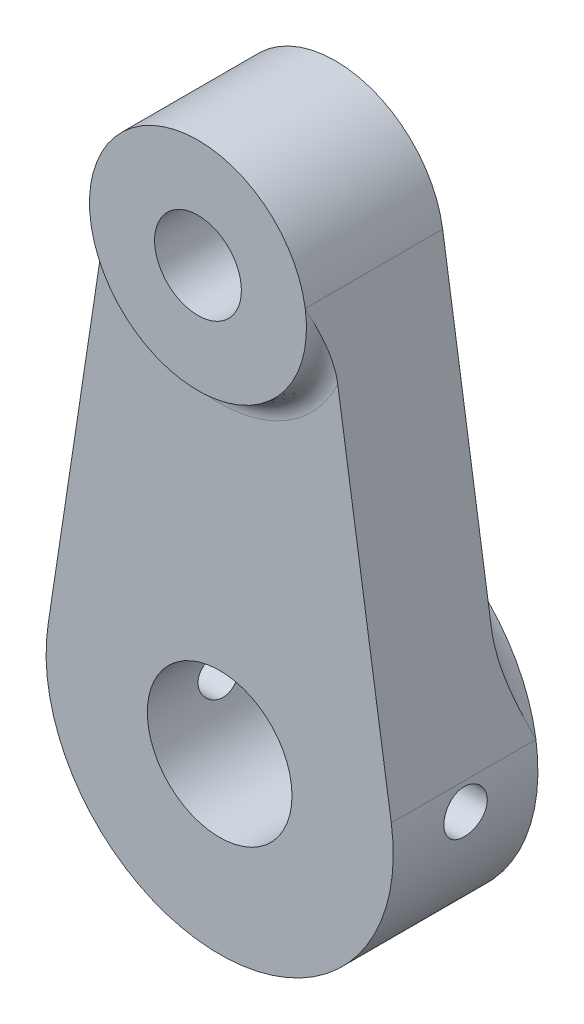
ISO-10303-21;
HEADER;
FILE_DESCRIPTION(('STEP AP214'),'2;1');
FILE_NAME('part.step','',(''),(''),'','','');
FILE_SCHEMA(('AUTOMOTIVE_DESIGN { 1 0 10303 214 1 1 1 1 }'));
ENDSEC;
DATA;
#1=APPLICATION_CONTEXT('core data for automotive mechanical design processes');
#2=APPLICATION_PROTOCOL_DEFINITION('international standard','automotive_design',2000,#1);
#3=PRODUCT_CONTEXT('',#1,'mechanical');
#4=PRODUCT('Part','Part','',(#3));
#5=PRODUCT_RELATED_PRODUCT_CATEGORY('part','',(#4));
#6=PRODUCT_DEFINITION_FORMATION('','',#4);
#7=PRODUCT_DEFINITION_CONTEXT('part definition',#1,'design');
#8=PRODUCT_DEFINITION('design','',#6,#7);
#9=PRODUCT_DEFINITION_SHAPE('','',#8);
#10=(LENGTH_UNIT() NAMED_UNIT(*) SI_UNIT(.MILLI.,.METRE.));
#11=(NAMED_UNIT(*) PLANE_ANGLE_UNIT() SI_UNIT($,.RADIAN.));
#12=(NAMED_UNIT(*) SI_UNIT($,.STERADIAN.) SOLID_ANGLE_UNIT());
#13=UNCERTAINTY_MEASURE_WITH_UNIT(LENGTH_MEASURE(1.E-05),#10,'distance_accuracy_value','');
#14=(GEOMETRIC_REPRESENTATION_CONTEXT(3) GLOBAL_UNCERTAINTY_ASSIGNED_CONTEXT((#13)) GLOBAL_UNIT_ASSIGNED_CONTEXT((#10,
#11,#12)) REPRESENTATION_CONTEXT('',''));
#15=CARTESIAN_POINT('',(0.,0.,0.));
#16=DIRECTION('',(0.,0.,1.));
#17=DIRECTION('',(1.,0.,0.));
#18=AXIS2_PLACEMENT_3D('',#15,#16,#17);
#19=CARTESIAN_POINT('',(0.,0.,9.5));
#20=DIRECTION('',(0.,0.,-1.));
#21=DIRECTION('',(-1.,0.,0.));
#22=AXIS2_PLACEMENT_3D('',#19,#20,#21);
#23=CYLINDRICAL_SURFACE('',#22,7.5);
#24=DIRECTION('',(0.,0.,-1.));
#25=VECTOR('',#24,1.);
#26=CARTESIAN_POINT('',(-7.41514497498195,1.125,8.));
#27=LINE('',#26,#25);
#28=CARTESIAN_POINT('',(-7.41514497498195,1.125,9.5));
#29=VERTEX_POINT('',#28);
#30=CARTESIAN_POINT('',(-7.41514497498195,1.125,0.));
#31=VERTEX_POINT('',#30);
#32=EDGE_CURVE('E131',#29,#31,#27,.T.);
#33=ORIENTED_EDGE('',*,*,#32,.F.);
#34=CARTESIAN_POINT('',(0.,0.,9.5));
#35=DIRECTION('',(0.,0.,1.));
#36=DIRECTION('',(1.,0.,0.));
#37=AXIS2_PLACEMENT_3D('',#34,#35,#36);
#38=CIRCLE('',#37,7.5);
#39=CARTESIAN_POINT('',(7.41514497498195,1.125,9.5));
#40=VERTEX_POINT('',#39);
#41=EDGE_CURVE('E146',#40,#29,#38,.T.);
#42=ORIENTED_EDGE('',*,*,#41,.F.);
#43=DIRECTION('',(0.,0.,-1.));
#44=VECTOR('',#43,1.);
#45=CARTESIAN_POINT('',(7.41514497498195,1.125,8.));
#46=LINE('',#45,#44);
#47=CARTESIAN_POINT('',(7.41514497498195,1.125,0.));
#48=VERTEX_POINT('',#47);
#49=EDGE_CURVE('E136',#40,#48,#46,.T.);
#50=ORIENTED_EDGE('',*,*,#49,.T.);
#51=CARTESIAN_POINT('',(0.,0.,0.));
#52=DIRECTION('',(0.,0.,1.));
#53=DIRECTION('',(1.,0.,0.));
#54=AXIS2_PLACEMENT_3D('',#51,#52,#53);
#55=CIRCLE('',#54,7.5);
#56=EDGE_CURVE('E143',#48,#31,#55,.T.);
#57=ORIENTED_EDGE('',*,*,#56,.T.);
#58=EDGE_LOOP('',(#33,#42,#50,#57));
#59=FACE_BOUND('',#58,.T.);
#60=ADVANCED_FACE('F45',(#59),#23,.T.);
#61=CARTESIAN_POINT('',(0.,0.,9.5));
#62=DIRECTION('',(0.,0.,1.));
#63=DIRECTION('',(1.,0.,0.));
#64=AXIS2_PLACEMENT_3D('',#61,#62,#63);
#65=PLANE('',#64);
#66=ORIENTED_EDGE('',*,*,#41,.T.);
#67=EDGE_CURVE('E149',#29,#40,#38,.T.);
#68=ORIENTED_EDGE('',*,*,#67,.T.);
#69=EDGE_LOOP('',(#66,#68));
#70=FACE_BOUND('',#69,.T.);
#71=CARTESIAN_POINT('',(0.,0.,9.5));
#72=DIRECTION('',(0.,0.,1.));
#73=DIRECTION('',(1.,0.,0.));
#74=AXIS2_PLACEMENT_3D('',#71,#72,#73);
#75=CIRCLE('',#74,3.);
#76=CARTESIAN_POINT('',(3.,0.,9.5));
#77=VERTEX_POINT('',#76);
#78=EDGE_CURVE('E140',#77,#77,#75,.T.);
#79=ORIENTED_EDGE('',*,*,#78,.F.);
#80=EDGE_LOOP('',(#79));
#81=FACE_BOUND('',#80,.T.);
#82=ADVANCED_FACE('F206',(#70,#81),#65,.T.);
#83=CARTESIAN_POINT('',(0.,0.,0.));
#84=DIRECTION('',(0.,0.,1.));
#85=DIRECTION('',(1.,0.,0.));
#86=AXIS2_PLACEMENT_3D('',#83,#84,#85);
#87=PLANE('',#86);
#88=DIRECTION('',(-0.15,0.98868599666426,0.));
#89=VECTOR('',#88,1.);
#90=CARTESIAN_POINT('',(7.41514497498195,1.125,0.));
#91=LINE('',#90,#89);
#92=CARTESIAN_POINT('',(10.7825665773319,-21.0704838873876,0.));
#93=VERTEX_POINT('',#92);
#94=EDGE_CURVE('E117',#93,#48,#91,.T.);
#95=ORIENTED_EDGE('',*,*,#94,.F.);
#96=CARTESIAN_POINT('',(0.,-30.,0.));
#97=DIRECTION('',(0.,0.,1.));
#98=DIRECTION('',(1.,0.,0.));
#99=AXIS2_PLACEMENT_3D('',#96,#97,#98);
#100=CIRCLE('',#99,14.);
#101=CARTESIAN_POINT('',(-10.7825665773319,-21.0704838873876,0.));
#102=VERTEX_POINT('',#101);
#103=EDGE_CURVE('E66',#93,#102,#100,.T.);
#104=ORIENTED_EDGE('',*,*,#103,.T.);
#105=DIRECTION('',(-0.15,-0.98868599666426,0.));
#106=VECTOR('',#105,1.);
#107=CARTESIAN_POINT('',(-7.41514497498195,1.125,0.));
#108=LINE('',#107,#106);
#109=EDGE_CURVE('E262',#31,#102,#108,.T.);
#110=ORIENTED_EDGE('',*,*,#109,.F.);
#111=ORIENTED_EDGE('',*,*,#56,.F.);
#112=EDGE_LOOP('',(#95,#104,#110,#111));
#113=FACE_BOUND('',#112,.T.);
#114=CARTESIAN_POINT('',(0.,0.,0.));
#115=DIRECTION('',(0.,0.,1.));
#116=DIRECTION('',(1.,0.,0.));
#117=AXIS2_PLACEMENT_3D('',#114,#115,#116);
#118=CIRCLE('',#117,3.);
#119=CARTESIAN_POINT('',(3.,0.,0.));
#120=VERTEX_POINT('',#119);
#121=EDGE_CURVE('E134',#120,#120,#118,.T.);
#122=ORIENTED_EDGE('',*,*,#121,.T.);
#123=EDGE_LOOP('',(#122));
#124=FACE_BOUND('',#123,.T.);
#125=ADVANCED_FACE('F213',(#113,#124),#87,.F.);
#126=CARTESIAN_POINT('',(0.,0.,9.5));
#127=DIRECTION('',(0.,0.,-1.));
#128=DIRECTION('',(-1.,0.,0.));
#129=AXIS2_PLACEMENT_3D('',#126,#127,#128);
#130=CYLINDRICAL_SURFACE('',#129,3.);
#131=ORIENTED_EDGE('',*,*,#78,.T.);
#132=EDGE_LOOP('',(#131));
#133=FACE_BOUND('',#132,.T.);
#134=ORIENTED_EDGE('',*,*,#121,.F.);
#135=EDGE_LOOP('',(#134));
#136=FACE_BOUND('',#135,.T.);
#137=ADVANCED_FACE('F244',(#133,#136),#130,.F.);
#138=CARTESIAN_POINT('',(-7.41514497498195,1.125,8.));
#139=DIRECTION('',(0.988685996664259,-0.15,0.));
#140=DIRECTION('',(0.15,0.98868599666426,0.));
#141=AXIS2_PLACEMENT_3D('',#138,#139,#140);
#142=PLANE('',#141);
#143=ORIENTED_EDGE('',*,*,#109,.T.);
#144=CARTESIAN_POINT('',(-10.7825665773319,-21.0704838873876,0.));
#145=CARTESIAN_POINT('',(-10.8036188188682,-21.2092442634229,-2.31503582348631E-05));
#146=CARTESIAN_POINT('',(-10.8246640712579,-21.3479585723159,-0.00391806260204699));
#147=CARTESIAN_POINT('',(-10.8666887706968,-21.6249534513113,-0.0186159968667627));
#148=CARTESIAN_POINT('',(-10.887668249274,-21.7632342292218,-0.0294149369178183));
#149=CARTESIAN_POINT('',(-10.9294771832798,-22.0388069464687,-0.0570495952061969));
#150=CARTESIAN_POINT('',(-10.9503068922632,-22.1761005570447,-0.0738686921604529));
#151=CARTESIAN_POINT('',(-10.9918550643829,-22.4499545301235,-0.112867745946441));
#152=CARTESIAN_POINT('',(-11.01257350871,-22.5865147686489,-0.135048581727671));
#153=CARTESIAN_POINT('',(-11.0741349985146,-22.9922813213399,-0.208221031006377));
#154=CARTESIAN_POINT('',(-11.1147941568967,-23.2602755915302,-0.266139002220647));
#155=CARTESIAN_POINT('',(-11.1956006419788,-23.7928905264656,-0.396600430720081));
#156=CARTESIAN_POINT('',(-11.2357475313623,-24.057508308753,-0.469155597397371));
#157=CARTESIAN_POINT('',(-11.3255176943163,-24.6492049956257,-0.645181872773761));
#158=CARTESIAN_POINT('',(-11.3749988644639,-24.975347262449,-0.751846245702443));
#159=CARTESIAN_POINT('',(-11.4733210373914,-25.623412299349,-0.977637512728872));
#160=CARTESIAN_POINT('',(-11.5221618536528,-25.9453338400379,-1.09676795093991));
#161=CARTESIAN_POINT('',(-11.668199360084,-26.9079020906793,-1.46654223551398));
#162=CARTESIAN_POINT('',(-11.764705168652,-27.5439950341984,-1.7291231398053));
#163=CARTESIAN_POINT('',(-11.8622035910899,-28.1866305339407,-1.99447949140113));
#164=CARTESIAN_POINT('',(-11.8632177762007,-28.1933152713876,-1.99723975408257));
#165=CARTESIAN_POINT('',(-11.8642319599711,-28.2,-2.));
#166=B_SPLINE_CURVE_WITH_KNOTS('',3,(#144,#145,#146,#147,#148,#149,#150,#151,#152,#153,#154,
#155,#156,#157,#158,#159,#160,#161,#162,#163,#164,#165),.UNSPECIFIED.,.F.,.F.,(4,2,2,2,2,2,2,2,
2,2,4),(0.,0.420924555769308,0.841600471990226,1.26112377507249,1.68071589727683,
2.51167215622664,3.3432958144477,4.38298370857807,5.42296799411915,7.50726078508849,
7.5291696874557),.UNSPECIFIED.);
#167=CARTESIAN_POINT('',(-11.8642319599711,-28.2,-2.));
#168=VERTEX_POINT('',#167);
#169=EDGE_CURVE('E11',#102,#168,#166,.T.);
#170=ORIENTED_EDGE('',*,*,#169,.T.);
#171=DIRECTION('',(0.,0.,-1.));
#172=VECTOR('',#171,1.);
#173=CARTESIAN_POINT('',(-11.8642319599711,-28.2,8.));
#174=LINE('',#173,#172);
#175=CARTESIAN_POINT('',(-11.8642319599711,-28.2,8.));
#176=VERTEX_POINT('',#175);
#177=EDGE_CURVE('E122',#176,#168,#174,.T.);
#178=ORIENTED_EDGE('',*,*,#177,.F.);
#179=DIRECTION('',(-0.15,-0.98868599666426,0.));
#180=VECTOR('',#179,1.);
#181=CARTESIAN_POINT('',(-7.41514497498195,1.125,8.));
#182=LINE('',#181,#180);
#183=CARTESIAN_POINT('',(-8.16138555281191,-3.79365072962088,8.));
#184=VERTEX_POINT('',#183);
#185=EDGE_CURVE('E104',#184,#176,#182,.T.);
#186=ORIENTED_EDGE('',*,*,#185,.F.);
#187=CARTESIAN_POINT('',(-8.16138555281191,-3.79365072962087,8.));
#188=CARTESIAN_POINT('',(-8.14750829911001,-3.70218242023938,8.0000121403172));
#189=CARTESIAN_POINT('',(-8.13363546717819,-3.61074325580559,8.00261451640834));
#190=CARTESIAN_POINT('',(-8.10593463809668,-3.42816044374639,8.01248057239108));
#191=CARTESIAN_POINT('',(-8.09210661948581,-3.33701665466516,8.01974152771349));
#192=CARTESIAN_POINT('',(-8.06455435732332,-3.15541308282199,8.03838025669386));
#193=CARTESIAN_POINT('',(-8.05082993048742,-3.06495209198932,8.04974626443729));
#194=CARTESIAN_POINT('',(-8.02345993863703,-2.88454990751402,8.07616459264724));
#195=CARTESIAN_POINT('',(-8.00981438673593,-2.79460880030489,8.09121750900753));
#196=CARTESIAN_POINT('',(-7.96931871353119,-2.52769210015145,8.1409327870465));
#197=CARTESIAN_POINT('',(-7.94259957938341,-2.35157987498539,8.18038019406932));
#198=CARTESIAN_POINT('',(-7.88953678468591,-2.00183026124352,8.26954900399619));
#199=CARTESIAN_POINT('',(-7.86319345680928,-1.82819506539574,8.31927897089961));
#200=CARTESIAN_POINT('',(-7.80108061911117,-1.41879444642777,8.44699925650627));
#201=CARTESIAN_POINT('',(-7.76547914832748,-1.18413660893117,8.52859539345209));
#202=CARTESIAN_POINT('',(-7.69488155857262,-0.718810953005341,8.70244113026362));
#203=CARTESIAN_POINT('',(-7.65988540847132,-0.488142929389905,8.79469018039228));
#204=CARTESIAN_POINT('',(-7.55532931919628,0.2010113461583,9.08212824512962));
#205=CARTESIAN_POINT('',(-7.48641184808941,0.655262936884536,9.28752409132617));
#206=CARTESIAN_POINT('',(-7.41672611215885,1.11457834542926,9.49528597324246));
#207=CARTESIAN_POINT('',(-7.41593554273077,1.11978917824882,9.49764299628243));
#208=CARTESIAN_POINT('',(-7.41514497498195,1.125,9.5));
#209=B_SPLINE_CURVE_WITH_KNOTS('',3,(#187,#188,#189,#190,#191,#192,#193,#194,#195,#196,#197,
#198,#199,#200,#201,#202,#203,#204,#205,#206,#207,#208),.UNSPECIFIED.,.F.,.F.,(4,2,2,2,2,2,2,2,
2,2,4),(0.,0.277466363585567,0.554770598761664,0.83128625044048,1.10784662327408,
1.65474565598516,2.20210203067785,2.95462836173667,3.70711587647497,5.21652765572335,
5.23384816385479),.UNSPECIFIED.);
#210=EDGE_CURVE('E222',#184,#29,#209,.T.);
#211=ORIENTED_EDGE('',*,*,#210,.T.);
#212=ORIENTED_EDGE('',*,*,#32,.T.);
#213=EDGE_LOOP('',(#143,#170,#178,#186,#211,#212));
#214=FACE_BOUND('',#213,.T.);
#215=ADVANCED_FACE('F128',(#214),#142,.F.);
#216=CARTESIAN_POINT('',(7.41514497498195,1.125,8.));
#217=DIRECTION('',(-0.988685996664259,-0.15,0.));
#218=DIRECTION('',(0.15,-0.98868599666426,0.));
#219=AXIS2_PLACEMENT_3D('',#216,#217,#218);
#220=PLANE('',#219);
#221=DIRECTION('',(0.,0.,-1.));
#222=VECTOR('',#221,1.);
#223=CARTESIAN_POINT('',(11.8642319599711,-28.2,8.));
#224=LINE('',#223,#222);
#225=CARTESIAN_POINT('',(11.8642319599711,-28.2,8.));
#226=VERTEX_POINT('',#225);
#227=CARTESIAN_POINT('',(11.8642319599711,-28.2,-2.));
#228=VERTEX_POINT('',#227);
#229=EDGE_CURVE('E123',#226,#228,#224,.T.);
#230=ORIENTED_EDGE('',*,*,#229,.T.);
#231=CARTESIAN_POINT('',(10.7825665773319,-21.0704838873876,0.));
#232=CARTESIAN_POINT('',(10.8036188188682,-21.2092442634229,-2.31503582348631E-05));
#233=CARTESIAN_POINT('',(10.8246640712579,-21.3479585723159,-0.00391806260204699));
#234=CARTESIAN_POINT('',(10.8666887706968,-21.6249534513113,-0.0186159968667627));
#235=CARTESIAN_POINT('',(10.887668249274,-21.7632342292218,-0.0294149369178183));
#236=CARTESIAN_POINT('',(10.9294771832798,-22.0388069464687,-0.0570495952061969));
#237=CARTESIAN_POINT('',(10.9503068922632,-22.1761005570447,-0.0738686921604529));
#238=CARTESIAN_POINT('',(10.9918550643829,-22.4499545301235,-0.112867745946441));
#239=CARTESIAN_POINT('',(11.01257350871,-22.5865147686489,-0.135048581727671));
#240=CARTESIAN_POINT('',(11.0741349985146,-22.9922813213399,-0.208221031006377));
#241=CARTESIAN_POINT('',(11.1147941568967,-23.2602755915302,-0.266139002220647));
#242=CARTESIAN_POINT('',(11.1956006419788,-23.7928905264656,-0.396600430720081));
#243=CARTESIAN_POINT('',(11.2357475313623,-24.057508308753,-0.469155597397371));
#244=CARTESIAN_POINT('',(11.3255176943163,-24.6492049956257,-0.645181872773761));
#245=CARTESIAN_POINT('',(11.3749988644639,-24.975347262449,-0.751846245702443));
#246=CARTESIAN_POINT('',(11.4733210373914,-25.623412299349,-0.977637512728872));
#247=CARTESIAN_POINT('',(11.5221618536528,-25.9453338400379,-1.09676795093991));
#248=CARTESIAN_POINT('',(11.668199360084,-26.9079020906793,-1.46654223551398));
#249=CARTESIAN_POINT('',(11.764705168652,-27.5439950341984,-1.7291231398053));
#250=CARTESIAN_POINT('',(11.8622035910899,-28.1866305339407,-1.99447949140113));
#251=CARTESIAN_POINT('',(11.8632177762007,-28.1933152713876,-1.99723975408257));
#252=CARTESIAN_POINT('',(11.8642319599711,-28.2,-2.));
#253=B_SPLINE_CURVE_WITH_KNOTS('',3,(#231,#232,#233,#234,#235,#236,#237,#238,#239,#240,#241,
#242,#243,#244,#245,#246,#247,#248,#249,#250,#251,#252),.UNSPECIFIED.,.F.,.F.,(4,2,2,2,2,2,2,2,
2,2,4),(0.,0.420924555769308,0.841600471990226,1.26112377507249,1.68071589727683,
2.51167215622664,3.3432958144477,4.38298370857807,5.42296799411915,7.50726078508849,
7.5291696874557),.UNSPECIFIED.);
#254=EDGE_CURVE('E59',#228,#93,#253,.F.);
#255=ORIENTED_EDGE('',*,*,#254,.T.);
#256=ORIENTED_EDGE('',*,*,#94,.T.);
#257=ORIENTED_EDGE('',*,*,#49,.F.);
#258=CARTESIAN_POINT('',(8.16138555281191,-3.79365072962087,8.));
#259=CARTESIAN_POINT('',(8.14750829911001,-3.70218242023938,8.0000121403172));
#260=CARTESIAN_POINT('',(8.13363546717819,-3.61074325580559,8.00261451640834));
#261=CARTESIAN_POINT('',(8.10593463809668,-3.42816044374639,8.01248057239108));
#262=CARTESIAN_POINT('',(8.09210661948581,-3.33701665466516,8.01974152771349));
#263=CARTESIAN_POINT('',(8.06455435732332,-3.15541308282199,8.03838025669386));
#264=CARTESIAN_POINT('',(8.05082993048742,-3.06495209198932,8.04974626443729));
#265=CARTESIAN_POINT('',(8.02345993863703,-2.88454990751402,8.07616459264724));
#266=CARTESIAN_POINT('',(8.00981438673593,-2.79460880030489,8.09121750900753));
#267=CARTESIAN_POINT('',(7.96931871353119,-2.52769210015145,8.1409327870465));
#268=CARTESIAN_POINT('',(7.94259957938341,-2.35157987498539,8.18038019406932));
#269=CARTESIAN_POINT('',(7.88953678468591,-2.00183026124352,8.26954900399619));
#270=CARTESIAN_POINT('',(7.86319345680928,-1.82819506539574,8.31927897089961));
#271=CARTESIAN_POINT('',(7.80108061911117,-1.41879444642777,8.44699925650627));
#272=CARTESIAN_POINT('',(7.76547914832748,-1.18413660893117,8.52859539345209));
#273=CARTESIAN_POINT('',(7.69488155857262,-0.718810953005341,8.70244113026362));
#274=CARTESIAN_POINT('',(7.65988540847132,-0.488142929389905,8.79469018039228));
#275=CARTESIAN_POINT('',(7.55532931919628,0.2010113461583,9.08212824512962));
#276=CARTESIAN_POINT('',(7.48641184808941,0.655262936884536,9.28752409132617));
#277=CARTESIAN_POINT('',(7.41672611215885,1.11457834542926,9.49528597324246));
#278=CARTESIAN_POINT('',(7.41593554273077,1.11978917824882,9.49764299628243));
#279=CARTESIAN_POINT('',(7.41514497498195,1.125,9.5));
#280=B_SPLINE_CURVE_WITH_KNOTS('',3,(#258,#259,#260,#261,#262,#263,#264,#265,#266,#267,#268,
#269,#270,#271,#272,#273,#274,#275,#276,#277,#278,#279),.UNSPECIFIED.,.F.,.F.,(4,2,2,2,2,2,2,2,
2,2,4),(0.,0.277466363585567,0.554770598761664,0.83128625044048,1.10784662327408,
1.65474565598516,2.20210203067785,2.95462836173667,3.70711587647497,5.21652765572335,
5.23384816385479),.UNSPECIFIED.);
#281=CARTESIAN_POINT('',(8.16138555281191,-3.79365072962088,8.));
#282=VERTEX_POINT('',#281);
#283=EDGE_CURVE('E228',#40,#282,#280,.F.);
#284=ORIENTED_EDGE('',*,*,#283,.T.);
#285=DIRECTION('',(-0.15,0.98868599666426,0.));
#286=VECTOR('',#285,1.);
#287=CARTESIAN_POINT('',(7.41514497498195,1.125,8.));
#288=LINE('',#287,#286);
#289=EDGE_CURVE('E116',#226,#282,#288,.T.);
#290=ORIENTED_EDGE('',*,*,#289,.F.);
#291=EDGE_LOOP('',(#230,#255,#256,#257,#284,#290));
#292=FACE_BOUND('',#291,.T.);
#293=ADVANCED_FACE('F202',(#292),#220,.F.);
#294=CARTESIAN_POINT('',(0.,0.,8.));
#295=DIRECTION('',(0.,0.,1.));
#296=DIRECTION('',(1.,0.,0.));
#297=AXIS2_PLACEMENT_3D('',#294,#295,#296);
#298=PLANE('',#297);
#299=ORIENTED_EDGE('',*,*,#289,.T.);
#300=CARTESIAN_POINT('',(0.,0.,8.));
#301=DIRECTION('',(0.,0.,1.));
#302=DIRECTION('',(1.,0.,0.));
#303=AXIS2_PLACEMENT_3D('',#300,#301,#302);
#304=CIRCLE('',#303,9.);
#305=EDGE_CURVE('E112',#282,#184,#304,.F.);
#306=ORIENTED_EDGE('',*,*,#305,.T.);
#307=ORIENTED_EDGE('',*,*,#185,.T.);
#308=CARTESIAN_POINT('',(0.,-30.,8.));
#309=DIRECTION('',(0.,0.,1.));
#310=DIRECTION('',(1.,0.,0.));
#311=AXIS2_PLACEMENT_3D('',#308,#309,#310);
#312=CIRCLE('',#311,12.);
#313=EDGE_CURVE('E109',#176,#226,#312,.T.);
#314=ORIENTED_EDGE('',*,*,#313,.T.);
#315=EDGE_LOOP('',(#299,#306,#307,#314));
#316=FACE_BOUND('',#315,.T.);
#317=CARTESIAN_POINT('',(0.,-30.,8.));
#318=DIRECTION('',(0.,0.,1.));
#319=DIRECTION('',(1.,0.,0.));
#320=AXIS2_PLACEMENT_3D('',#317,#318,#319);
#321=CIRCLE('',#320,5.);
#322=CARTESIAN_POINT('',(5.,-30.,8.));
#323=VERTEX_POINT('',#322);
#324=EDGE_CURVE('E126',#323,#323,#321,.T.);
#325=ORIENTED_EDGE('',*,*,#324,.F.);
#326=EDGE_LOOP('',(#325));
#327=FACE_BOUND('',#326,.T.);
#328=ADVANCED_FACE('F107',(#316,#327),#298,.T.);
#329=CARTESIAN_POINT('',(0.,-30.,-2.));
#330=DIRECTION('',(0.,0.,1.));
#331=DIRECTION('',(1.,0.,0.));
#332=AXIS2_PLACEMENT_3D('',#329,#330,#331);
#333=CYLINDRICAL_SURFACE('',#332,12.);
#334=CARTESIAN_POINT('',(-12.,-30.,1.5));
#335=CARTESIAN_POINT('',(-11.9999988293786,-30.0839046573335,1.50000356456143));
#336=CARTESIAN_POINT('',(-11.9991107073294,-30.1678617445816,1.50706372750157));
#337=CARTESIAN_POINT('',(-11.9956532406682,-30.3334396812539,1.53511665274248));
#338=CARTESIAN_POINT('',(-11.9930821406486,-30.4150579983742,1.55612396275403));
#339=CARTESIAN_POINT('',(-11.9865483662664,-30.5735373448878,1.61144258634845));
#340=CARTESIAN_POINT('',(-11.9825866287333,-30.6504015360877,1.64574494508591));
#341=CARTESIAN_POINT('',(-11.9737122052686,-30.7972676849358,1.72666037038187));
#342=CARTESIAN_POINT('',(-11.9687996825047,-30.8672708169338,1.77327132511843));
#343=CARTESIAN_POINT('',(-11.958541927838,-30.9988276901588,1.87775516990375));
#344=CARTESIAN_POINT('',(-11.9531946881545,-31.0603382189623,1.93568227760774));
#345=CARTESIAN_POINT('',(-11.9426863560585,-31.1727916761345,2.06103769412198));
#346=CARTESIAN_POINT('',(-11.9375252731456,-31.2237340658353,2.12846648694794));
#347=CARTESIAN_POINT('',(-11.9279538337175,-31.3137660967704,2.27119198653939));
#348=CARTESIAN_POINT('',(-11.9235460630675,-31.3528152575646,2.34651441694076));
#349=CARTESIAN_POINT('',(-11.9160067707461,-31.4176938459451,2.50271223116841));
#350=CARTESIAN_POINT('',(-11.9128752006788,-31.4435237748391,2.58358740428821));
#351=CARTESIAN_POINT('',(-11.9082620376217,-31.4810993880149,2.74814651735206));
#352=CARTESIAN_POINT('',(-11.9067719006205,-31.492918028839,2.83181355462252));
#353=CARTESIAN_POINT('',(-11.9055841688568,-31.5023613297343,2.9999557580831));
#354=CARTESIAN_POINT('',(-11.905886502009,-31.4999865606014,3.08443089163878));
#355=CARTESIAN_POINT('',(-11.9082417322185,-31.4811703418687,3.25128289634927));
#356=CARTESIAN_POINT('',(-11.910284627762,-31.4648092577908,3.33366899172016));
#357=CARTESIAN_POINT('',(-11.9158751985458,-31.4186102299092,3.49451701273139));
#358=CARTESIAN_POINT('',(-11.9194229042743,-31.3887720130511,3.57297885882842));
#359=CARTESIAN_POINT('',(-11.9276346951879,-31.316379335947,3.72400079941301));
#360=CARTESIAN_POINT('',(-11.9323018392687,-31.2737899522246,3.79654398014939));
#361=CARTESIAN_POINT('',(-11.9422242685836,-31.1771288816741,3.93348401664795));
#362=CARTESIAN_POINT('',(-11.947479580714,-31.1230566696485,3.99788049958421));
#363=CARTESIAN_POINT('',(-11.9580306593425,-31.0045194664523,4.11716562643365));
#364=CARTESIAN_POINT('',(-11.9633264543213,-30.939985204704,4.17198545505959));
#365=CARTESIAN_POINT('',(-11.9733277953351,-30.8025943014683,4.27002532801833));
#366=CARTESIAN_POINT('',(-11.978033340009,-30.7297376407909,4.3132453456032));
#367=CARTESIAN_POINT('',(-11.9863269133115,-30.5777170028181,4.38685879227835));
#368=CARTESIAN_POINT('',(-11.9899145664092,-30.4985509172026,4.41724791232874));
#369=CARTESIAN_POINT('',(-11.9955647146804,-30.3361847642586,4.46428229611395));
#370=CARTESIAN_POINT('',(-11.9976272812552,-30.2529848859784,4.48092820328223));
#371=CARTESIAN_POINT('',(-11.9999855784646,-30.0855078983481,4.49991445455633));
#372=CARTESIAN_POINT('',(-12.0002930168558,-30.0012416941192,4.50234959541844));
#373=CARTESIAN_POINT('',(-11.9991380280326,-29.8335023781015,4.49309535956643));
#374=CARTESIAN_POINT('',(-11.9976756385093,-29.7500292494612,4.48140628364905));
#375=CARTESIAN_POINT('',(-11.9931526125402,-29.5865252953671,4.44431417473537));
#376=CARTESIAN_POINT('',(-11.9900972448832,-29.5064840577452,4.41895634195842));
#377=CARTESIAN_POINT('',(-11.9827303386012,-29.351790207085,4.35529352885225));
#378=CARTESIAN_POINT('',(-11.9784187573237,-29.2771377771208,4.31698810890514));
#379=CARTESIAN_POINT('',(-11.9689909374607,-29.1349172875875,4.22828811749552));
#380=CARTESIAN_POINT('',(-11.9638706642551,-29.0673877440337,4.17783222611662));
#381=CARTESIAN_POINT('',(-11.9534108539539,-28.9417218062242,4.06635030147948));
#382=CARTESIAN_POINT('',(-11.9480713081614,-28.8835857849979,4.00532384864941));
#383=CARTESIAN_POINT('',(-11.9377386327755,-28.7780208247092,3.87401554994572));
#384=CARTESIAN_POINT('',(-11.932747648328,-28.7306547236592,3.80368299221377));
#385=CARTESIAN_POINT('',(-11.9237124662229,-28.6484082663339,3.65600505308717));
#386=CARTESIAN_POINT('',(-11.9196682495862,-28.613527659763,3.57865981231409));
#387=CARTESIAN_POINT('',(-11.912999102358,-28.5573440526801,3.41935480851143));
#388=CARTESIAN_POINT('',(-11.9103704711087,-28.5360056235257,3.33740770197122));
#389=CARTESIAN_POINT('',(-11.9068194954447,-28.5073980036793,3.1710585097316));
#390=CARTESIAN_POINT('',(-11.9058970716527,-28.5001281584785,3.0866565384246));
#391=CARTESIAN_POINT('',(-11.9058652618947,-28.4998760783491,2.91841864247719));
#392=CARTESIAN_POINT('',(-11.9067433485117,-28.5067951213804,2.83458285100087));
#393=CARTESIAN_POINT('',(-11.9101866872232,-28.5345153570904,2.66927572239295));
#394=CARTESIAN_POINT('',(-11.9127519394985,-28.5553165512565,2.58780438551472));
#395=CARTESIAN_POINT('',(-11.9192766946473,-28.6101797557862,2.42955182594016));
#396=CARTESIAN_POINT('',(-11.9232356975567,-28.6442370114174,2.35276893298691));
#397=CARTESIAN_POINT('',(-11.9321026994689,-28.7246358587098,2.20599200757101));
#398=CARTESIAN_POINT('',(-11.9370107103625,-28.7709776042942,2.1359980601881));
#399=CARTESIAN_POINT('',(-11.9472636285134,-28.8749962012405,2.00428126479572));
#400=CARTESIAN_POINT('',(-11.9526112325042,-28.932746624535,1.94261672342701));
#401=CARTESIAN_POINT('',(-11.9631169895574,-29.057789863819,1.82981590489922));
#402=CARTESIAN_POINT('',(-11.9682750976535,-29.1250849265151,1.77868211353541));
#403=CARTESIAN_POINT('',(-11.9778423395205,-29.2676006274875,1.68822878573682));
#404=CARTESIAN_POINT('',(-11.9822485504698,-29.3428504322423,1.64895491646045));
#405=CARTESIAN_POINT('',(-11.9897858944604,-29.4988902586192,1.58365725425023));
#406=CARTESIAN_POINT('',(-11.9929184122174,-29.5796741514779,1.55761906418792));
#407=CARTESIAN_POINT('',(-11.9968003219665,-29.7173965368192,1.52576439709722));
#408=CARTESIAN_POINT('',(-11.9979943553727,-29.7734666018898,1.51611663481076));
#409=CARTESIAN_POINT('',(-11.9995945879751,-29.8863497620725,1.50323325258406));
#410=CARTESIAN_POINT('',(-12.0000007929808,-29.9431628517024,1.49999758536042));
#411=CARTESIAN_POINT('',(-12.,-30.,1.5));
#412=B_SPLINE_CURVE_WITH_KNOTS('',3,(#334,#335,#336,#337,#338,#339,#340,#341,#342,#343,#344,
#345,#346,#347,#348,#349,#350,#351,#352,#353,#354,#355,#356,#357,#358,#359,#360,#361,#362,#363,
#364,#365,#366,#367,#368,#369,#370,#371,#372,#373,#374,#375,#376,#377,#378,#379,#380,#381,#382,
#383,#384,#385,#386,#387,#388,#389,#390,#391,#392,#393,#394,#395,#396,#397,#398,#399,#400,#401,
#402,#403,#404,#405,#406,#407,#408,#409,#410,#411),.UNSPECIFIED.,.T.,.F.,(4,2,2,2,2,2,2,2,2,2,2,
2,2,2,2,2,2,2,2,2,2,2,2,2,2,2,2,2,2,2,2,2,2,2,2,2,2,2,4),(0.,0.251506363665749,
0.503275476566057,0.754875304909062,1.00643199354644,1.25922487921106,1.51203064680006,
1.76568750191322,2.01933473698084,2.27165535171793,2.52396581930799,2.77483617865015,
3.02571162099745,3.2772805577132,3.52886100308183,3.7821808688185,4.03550131867869,
4.28890677438964,4.54230036542269,4.79400167635153,5.04569762701158,5.29656632336038,
5.54744353847369,5.79961441757054,6.05179530825054,6.30541182904545,6.55902326532924,
6.81196844568556,7.06490185806375,7.3160814072133,7.5672609832773,7.81835054823894,
8.06944325947359,8.32221142615099,8.57503919082009,8.82882841822113,9.08234099210421,
9.25271305912579,9.42308386980263),.UNSPECIFIED.);
#413=CARTESIAN_POINT('',(-12.,-30.,1.5));
#414=VERTEX_POINT('',#413);
#415=EDGE_CURVE('E186',#414,#414,#412,.T.);
#416=ORIENTED_EDGE('',*,*,#415,.F.);
#417=EDGE_LOOP('',(#416));
#418=FACE_BOUND('',#417,.T.);
#419=CARTESIAN_POINT('',(12.,-30.,1.5));
#420=CARTESIAN_POINT('',(11.9999988293786,-29.9160953426665,1.50000356456143));
#421=CARTESIAN_POINT('',(11.9991107073294,-29.8321382554184,1.50706372750157));
#422=CARTESIAN_POINT('',(11.9956532406682,-29.6665603187461,1.53511665274248));
#423=CARTESIAN_POINT('',(11.9930821406486,-29.5849420016258,1.55612396275403));
#424=CARTESIAN_POINT('',(11.9865483662664,-29.4264626551122,1.61144258634845));
#425=CARTESIAN_POINT('',(11.9825866287333,-29.3495984639123,1.64574494508591));
#426=CARTESIAN_POINT('',(11.9737122052686,-29.2027323150642,1.72666037038187));
#427=CARTESIAN_POINT('',(11.9687996825047,-29.1327291830662,1.77327132511843));
#428=CARTESIAN_POINT('',(11.958541927838,-29.0011723098412,1.87775516990375));
#429=CARTESIAN_POINT('',(11.9531946881545,-28.9396617810377,1.93568227760774));
#430=CARTESIAN_POINT('',(11.9426863560585,-28.8272083238655,2.06103769412198));
#431=CARTESIAN_POINT('',(11.9375252731456,-28.7762659341646,2.12846648694794));
#432=CARTESIAN_POINT('',(11.9279538337175,-28.6862339032296,2.27119198653939));
#433=CARTESIAN_POINT('',(11.9235460630675,-28.6471847424354,2.34651441694076));
#434=CARTESIAN_POINT('',(11.9160067707461,-28.5823061540549,2.50271223116841));
#435=CARTESIAN_POINT('',(11.9128752006788,-28.5564762251609,2.5835874042882));
#436=CARTESIAN_POINT('',(11.9082620376217,-28.5189006119851,2.74814651735206));
#437=CARTESIAN_POINT('',(11.9067719006205,-28.507081971161,2.83181355462251));
#438=CARTESIAN_POINT('',(11.9055841688568,-28.4976386702657,2.9999557580831));
#439=CARTESIAN_POINT('',(11.905886502009,-28.5000134393985,3.08443089163877));
#440=CARTESIAN_POINT('',(11.9082417322185,-28.5188296581312,3.25128289634927));
#441=CARTESIAN_POINT('',(11.910284627762,-28.5351907422092,3.33366899172016));
#442=CARTESIAN_POINT('',(11.9158751985458,-28.5813897700908,3.49451701273139));
#443=CARTESIAN_POINT('',(11.9194229042743,-28.6112279869489,3.57297885882842));
#444=CARTESIAN_POINT('',(11.9276346951879,-28.683620664053,3.72400079941301));
#445=CARTESIAN_POINT('',(11.9323018392687,-28.7262100477754,3.79654398014939));
#446=CARTESIAN_POINT('',(11.9422242685836,-28.8228711183258,3.93348401664795));
#447=CARTESIAN_POINT('',(11.947479580714,-28.8769433303515,3.99788049958421));
#448=CARTESIAN_POINT('',(11.9580306593425,-28.9954805335477,4.11716562643365));
#449=CARTESIAN_POINT('',(11.9633264543213,-29.060014795296,4.17198545505959));
#450=CARTESIAN_POINT('',(11.9733277953351,-29.1974056985316,4.27002532801833));
#451=CARTESIAN_POINT('',(11.978033340009,-29.270262359209,4.3132453456032));
#452=CARTESIAN_POINT('',(11.9863269133115,-29.4222829971819,4.38685879227835));
#453=CARTESIAN_POINT('',(11.9899145664092,-29.5014490827974,4.41724791232874));
#454=CARTESIAN_POINT('',(11.9955647146804,-29.6638152357414,4.46428229611395));
#455=CARTESIAN_POINT('',(11.9976272812552,-29.7470151140216,4.48092820328223));
#456=CARTESIAN_POINT('',(11.9999855784646,-29.9144921016519,4.49991445455633));
#457=CARTESIAN_POINT('',(12.0002930168558,-29.9987583058808,4.50234959541844));
#458=CARTESIAN_POINT('',(11.9991380280326,-30.1664976218985,4.49309535956643));
#459=CARTESIAN_POINT('',(11.9976756385093,-30.2499707505388,4.48140628364905));
#460=CARTESIAN_POINT('',(11.9931526125402,-30.4134747046329,4.44431417473537));
#461=CARTESIAN_POINT('',(11.9900972448832,-30.4935159422548,4.41895634195842));
#462=CARTESIAN_POINT('',(11.9827303386012,-30.648209792915,4.35529352885225));
#463=CARTESIAN_POINT('',(11.9784187573237,-30.7228622228792,4.31698810890515));
#464=CARTESIAN_POINT('',(11.9689909374607,-30.8650827124124,4.22828811749553));
#465=CARTESIAN_POINT('',(11.9638706642551,-30.9326122559663,4.17783222611662));
#466=CARTESIAN_POINT('',(11.9534108539539,-31.0582781937758,4.06635030147948));
#467=CARTESIAN_POINT('',(11.9480713081614,-31.1164142150021,4.00532384864941));
#468=CARTESIAN_POINT('',(11.9377386327755,-31.2219791752908,3.87401554994572));
#469=CARTESIAN_POINT('',(11.932747648328,-31.2693452763408,3.80368299221377));
#470=CARTESIAN_POINT('',(11.9237124662229,-31.3515917336661,3.65600505308717));
#471=CARTESIAN_POINT('',(11.9196682495862,-31.386472340237,3.57865981231409));
#472=CARTESIAN_POINT('',(11.912999102358,-31.4426559473199,3.41935480851143));
#473=CARTESIAN_POINT('',(11.9103704711087,-31.4639943764743,3.33740770197122));
#474=CARTESIAN_POINT('',(11.9068194954447,-31.4926019963207,3.1710585097316));
#475=CARTESIAN_POINT('',(11.9058970716527,-31.4998718415214,3.0866565384246));
#476=CARTESIAN_POINT('',(11.9058652618947,-31.5001239216509,2.9184186424772));
#477=CARTESIAN_POINT('',(11.9067433485117,-31.4932048786196,2.83458285100087));
#478=CARTESIAN_POINT('',(11.9101866872232,-31.4654846429096,2.66927572239296));
#479=CARTESIAN_POINT('',(11.9127519394985,-31.4446834487435,2.58780438551473));
#480=CARTESIAN_POINT('',(11.9192766946473,-31.3898202442138,2.42955182594016));
#481=CARTESIAN_POINT('',(11.9232356975567,-31.3557629885826,2.35276893298691));
#482=CARTESIAN_POINT('',(11.9321026994689,-31.2753641412902,2.20599200757101));
#483=CARTESIAN_POINT('',(11.9370107103625,-31.2290223957058,2.13599806018811));
#484=CARTESIAN_POINT('',(11.9472636285134,-31.1250037987595,2.00428126479572));
#485=CARTESIAN_POINT('',(11.9526112325042,-31.067253375465,1.94261672342702));
#486=CARTESIAN_POINT('',(11.9631169895574,-30.942210136181,1.82981590489922));
#487=CARTESIAN_POINT('',(11.9682750976535,-30.8749150734849,1.77868211353541));
#488=CARTESIAN_POINT('',(11.9778423395205,-30.7323993725125,1.68822878573683));
#489=CARTESIAN_POINT('',(11.9822485504698,-30.6571495677577,1.64895491646045));
#490=CARTESIAN_POINT('',(11.9897858944604,-30.5011097413808,1.58365725425023));
#491=CARTESIAN_POINT('',(11.9929184122174,-30.4203258485221,1.55761906418793));
#492=CARTESIAN_POINT('',(11.9968003219665,-30.2826034631808,1.52576439709722));
#493=CARTESIAN_POINT('',(11.9979943553727,-30.2265333981102,1.51611663481076));
#494=CARTESIAN_POINT('',(11.9995945879751,-30.1136502379275,1.50323325258406));
#495=CARTESIAN_POINT('',(12.0000007929808,-30.0568371482976,1.49999758536042));
#496=CARTESIAN_POINT('',(12.,-30.,1.5));
#497=B_SPLINE_CURVE_WITH_KNOTS('',3,(#419,#420,#421,#422,#423,#424,#425,#426,#427,#428,#429,
#430,#431,#432,#433,#434,#435,#436,#437,#438,#439,#440,#441,#442,#443,#444,#445,#446,#447,#448,
#449,#450,#451,#452,#453,#454,#455,#456,#457,#458,#459,#460,#461,#462,#463,#464,#465,#466,#467,
#468,#469,#470,#471,#472,#473,#474,#475,#476,#477,#478,#479,#480,#481,#482,#483,#484,#485,#486,
#487,#488,#489,#490,#491,#492,#493,#494,#495,#496),.UNSPECIFIED.,.T.,.F.,(4,2,2,2,2,2,2,2,2,2,2,
2,2,2,2,2,2,2,2,2,2,2,2,2,2,2,2,2,2,2,2,2,2,2,2,2,2,2,4),(0.,0.251506363665749,
0.503275476566056,0.754875304909062,1.00643199354644,1.25922487921106,1.51203064680006,
1.76568750191322,2.01933473698084,2.27165535171793,2.52396581930799,2.77483617865015,
3.02571162099745,3.2772805577132,3.52886100308184,3.78218086881851,4.03550131867868,
4.28890677438963,4.54230036542268,4.79400167635153,5.04569762701158,5.29656632336038,
5.54744353847369,5.79961441757054,6.05179530825053,6.30541182904545,6.55902326532924,
6.81196844568556,7.06490185806375,7.31608140721329,7.5672609832773,7.81835054823893,
8.06944325947359,8.32221142615098,8.57503919082008,8.82882841822112,9.0823409921042,
9.25271305912578,9.42308386980263),.UNSPECIFIED.);
#498=CARTESIAN_POINT('',(12.,-30.,1.5));
#499=VERTEX_POINT('',#498);
#500=EDGE_CURVE('E181',#499,#499,#497,.T.);
#501=ORIENTED_EDGE('',*,*,#500,.F.);
#502=EDGE_LOOP('',(#501));
#503=FACE_BOUND('',#502,.T.);
#504=CARTESIAN_POINT('',(0.,-30.,-2.));
#505=DIRECTION('',(0.,0.,1.));
#506=DIRECTION('',(1.,0.,0.));
#507=AXIS2_PLACEMENT_3D('',#504,#505,#506);
#508=CIRCLE('',#507,12.);
#509=EDGE_CURVE('E269',#168,#228,#508,.T.);
#510=ORIENTED_EDGE('',*,*,#509,.T.);
#511=ORIENTED_EDGE('',*,*,#229,.F.);
#512=ORIENTED_EDGE('',*,*,#313,.F.);
#513=ORIENTED_EDGE('',*,*,#177,.T.);
#514=EDGE_LOOP('',(#510,#511,#512,#513));
#515=FACE_BOUND('',#514,.T.);
#516=ADVANCED_FACE('F121',(#418,#503,#515),#333,.T.);
#517=CARTESIAN_POINT('',(0.,-30.,-2.));
#518=DIRECTION('',(0.,0.,1.));
#519=DIRECTION('',(1.,0.,0.));
#520=AXIS2_PLACEMENT_3D('',#517,#518,#519);
#521=CYLINDRICAL_SURFACE('',#520,5.);
#522=CARTESIAN_POINT('',(5.,-30.,1.5));
#523=CARTESIAN_POINT('',(4.9999992925055,-29.9177113872467,1.50000099748489));
#524=CARTESIAN_POINT('',(4.99794915693954,-29.8354126816485,1.50679386362396));
#525=CARTESIAN_POINT('',(4.98997105593691,-29.6732118746951,1.5337213542221));
#526=CARTESIAN_POINT('',(4.98404193389692,-29.5933104955886,1.55385995802334));
#527=CARTESIAN_POINT('',(4.96895552501837,-29.4382672922455,1.60674601691026));
#528=CARTESIAN_POINT('',(4.95980300250426,-29.3631186356046,1.63947486961893));
#529=CARTESIAN_POINT('',(4.93922109237645,-29.2193758189469,1.71653609305583));
#530=CARTESIAN_POINT('',(4.92779140192067,-29.1507825325303,1.76087000739541));
#531=CARTESIAN_POINT('',(4.90350737192774,-29.0201282028163,1.86122400747267));
#532=CARTESIAN_POINT('',(4.89062383657036,-28.9582819287557,1.91751662588591));
#533=CARTESIAN_POINT('',(4.86505834210442,-28.8447507907668,2.03960922991018));
#534=CARTESIAN_POINT('',(4.85237641724502,-28.7930676367256,2.10541081212496));
#535=CARTESIAN_POINT('',(4.82834113993772,-28.7001996227629,2.24647075303761));
#536=CARTESIAN_POINT('',(4.81702406663875,-28.6592769097779,2.32190846099073));
#537=CARTESIAN_POINT('',(4.79743620394031,-28.5907860522524,2.47898925423029));
#538=CARTESIAN_POINT('',(4.78916468313311,-28.5632147008003,2.56063084392797));
#539=CARTESIAN_POINT('',(4.77690870838434,-28.5229836631735,2.72539026613046));
#540=CARTESIAN_POINT('',(4.77281069324533,-28.5099280376532,2.80840274386394));
#541=CARTESIAN_POINT('',(4.76902789749767,-28.4978626938533,2.97553315621676));
#542=CARTESIAN_POINT('',(4.76934204760571,-28.4988495723892,3.05965081805909));
#543=CARTESIAN_POINT('',(4.77424744067778,-28.5145302280019,3.22338390860848));
#544=CARTESIAN_POINT('',(4.77868388599141,-28.5287279473731,3.30305225036224));
#545=CARTESIAN_POINT('',(4.79108356228624,-28.5696257957294,3.45881978627346));
#546=CARTESIAN_POINT('',(4.79904714132351,-28.5963271585836,3.53491862737433));
#547=CARTESIAN_POINT('',(4.81772733074973,-28.6618397334632,3.68260034966074));
#548=CARTESIAN_POINT('',(4.82848016115952,-28.7008118306536,3.75410708395526));
#549=CARTESIAN_POINT('',(4.85150987000065,-28.7896477741132,3.88973202201019));
#550=CARTESIAN_POINT('',(4.86378711746991,-28.8395142599741,3.95384842941378));
#551=CARTESIAN_POINT('',(4.88911011297937,-28.9511870923445,4.07568619076202));
#552=CARTESIAN_POINT('',(4.90216654310498,-29.013405092533,4.13302866402967));
#553=CARTESIAN_POINT('',(4.92712244063259,-29.146736740686,4.23655398406425));
#554=CARTESIAN_POINT('',(4.9390218351841,-29.2178509481391,4.28273612841443));
#555=CARTESIAN_POINT('',(4.9604316006947,-29.3676449616572,4.36285992246473));
#556=CARTESIAN_POINT('',(4.96992543668314,-29.446372250252,4.39671751624986));
#557=CARTESIAN_POINT('',(4.98533521832222,-29.6087545843965,4.45059959009963));
#558=CARTESIAN_POINT('',(4.99125216186999,-29.6924082484104,4.47062792853249));
#559=CARTESIAN_POINT('',(4.99868364643538,-29.8590477573317,4.4956521778994));
#560=CARTESIAN_POINT('',(5.0003485041779,-29.9419499023988,4.50116158580161));
#561=CARTESIAN_POINT('',(4.9995292324176,-30.1074996058234,4.49843084428792));
#562=CARTESIAN_POINT('',(4.99704565677757,-30.1901471966908,4.49019253034856));
#563=CARTESIAN_POINT('',(4.98830696987163,-30.3509036053097,4.46061538888851));
#564=CARTESIAN_POINT('',(4.98213829799417,-30.4290727726142,4.43957661241913));
#565=CARTESIAN_POINT('',(4.96674347841533,-30.5807546389545,4.3853567672218));
#566=CARTESIAN_POINT('',(4.95751696321085,-30.6542667770256,4.35217423896214));
#567=CARTESIAN_POINT('',(4.93669654351325,-30.796437189461,4.27374683451887));
#568=CARTESIAN_POINT('',(4.92505280829675,-30.8649438261997,4.22824065905203));
#569=CARTESIAN_POINT('',(4.90073468764318,-30.9935233079801,4.12677524594719));
#570=CARTESIAN_POINT('',(4.8880600443108,-31.0535940323559,4.07081338811233));
#571=CARTESIAN_POINT('',(4.86253171869138,-31.1658574455103,3.94761269163066));
#572=CARTESIAN_POINT('',(4.84968825033268,-31.217684812315,3.88003812422827));
#573=CARTESIAN_POINT('',(4.82576515238464,-31.3092899507215,3.73687206098647));
#574=CARTESIAN_POINT('',(4.81468547654652,-31.3490680382947,3.66128077544179));
#575=CARTESIAN_POINT('',(4.79567189615055,-31.4151734712717,3.50446750874532));
#576=CARTESIAN_POINT('',(4.78772337843827,-31.4415634693705,3.42327381346341));
#577=CARTESIAN_POINT('',(4.77591594362794,-31.4802173081511,3.25731203106852));
#578=CARTESIAN_POINT('',(4.77205562508301,-31.4924859897878,3.17254517921233));
#579=CARTESIAN_POINT('',(4.76899972496087,-31.5022198448506,3.00563848162377));
#580=CARTESIAN_POINT('',(4.76961647442755,-31.5002805530849,2.92353634898242));
#581=CARTESIAN_POINT('',(4.77499401288294,-31.4830750544481,2.7608858966272));
#582=CARTESIAN_POINT('',(4.77975463592551,-31.4678093812472,2.68033751482365));
#583=CARTESIAN_POINT('',(4.79275763670386,-31.4247688880414,2.52405460085715));
#584=CARTESIAN_POINT('',(4.80095604545965,-31.3971517550707,2.44827271263831));
#585=CARTESIAN_POINT('',(4.81990278909137,-31.3303150712113,2.30235756118228));
#586=CARTESIAN_POINT('',(4.83065161194312,-31.2910932996288,2.23222538235924));
#587=CARTESIAN_POINT('',(4.85397676425833,-31.2004876380507,2.09683688347289));
#588=CARTESIAN_POINT('',(4.86660540163798,-31.1487127609299,2.03185123873959));
#589=CARTESIAN_POINT('',(4.89201320450026,-31.0351743462978,1.91129750169214));
#590=CARTESIAN_POINT('',(4.90479240823905,-30.9734082171345,1.85573186053224));
#591=CARTESIAN_POINT('',(4.92950936570649,-30.8394657621832,1.75397658770497));
#592=CARTESIAN_POINT('',(4.94141159765674,-30.7670378857906,1.70810855314451));
#593=CARTESIAN_POINT('',(4.96260680455813,-30.6151413739835,1.62926483009597));
#594=CARTESIAN_POINT('',(4.97190099931067,-30.535676052999,1.59628311172549));
#595=CARTESIAN_POINT('',(4.98602174969301,-30.3807577126553,1.54710472434725));
#596=CARTESIAN_POINT('',(4.99122027381068,-30.3057869619542,1.52948832711675));
#597=CARTESIAN_POINT('',(4.99820944494493,-30.1538801952308,1.50593647475842));
#598=CARTESIAN_POINT('',(5.0000006615474,-30.0769445098581,1.49999906729518));
#599=CARTESIAN_POINT('',(5.,-30.,1.5));
#600=B_SPLINE_CURVE_WITH_KNOTS('',3,(#522,#523,#524,#525,#526,#527,#528,#529,#530,#531,#532,
#533,#534,#535,#536,#537,#538,#539,#540,#541,#542,#543,#544,#545,#546,#547,#548,#549,#550,#551,
#552,#553,#554,#555,#556,#557,#558,#559,#560,#561,#562,#563,#564,#565,#566,#567,#568,#569,#570,
#571,#572,#573,#574,#575,#576,#577,#578,#579,#580,#581,#582,#583,#584,#585,#586,#587,#588,#589,
#590,#591,#592,#593,#594,#595,#596,#597,#598,#599),.UNSPECIFIED.,.T.,.F.,(4,2,2,2,2,2,2,2,2,2,2,
2,2,2,2,2,2,2,2,2,2,2,2,2,2,2,2,2,2,2,2,2,2,2,2,2,2,2,4),(0.,0.246583203612614,
0.493239964846001,0.739533676300876,0.985860164412702,1.23855602948192,1.49129437288633,
1.74971481004109,2.00807314543224,2.25919689356599,2.5102597831909,2.75226016697676,
2.99428443658002,3.2396242644712,3.48502360158556,3.74067104048167,3.99633456531072,
4.25371046881689,4.51101453528808,4.75908809438545,5.00712853550327,5.24956746682327,
5.49203554593729,5.74011305702909,5.98825282000191,6.24540400322819,6.50254844252681,
6.75847814951252,7.01432009460284,7.25950155466943,7.504673196616,7.74680040402722,
7.98897397553108,8.23996925679932,8.49102974897503,8.74942996156671,9.00770911595236,
9.2383169193046,9.46888616948875),.UNSPECIFIED.);
#601=CARTESIAN_POINT('',(5.,-30.,1.5));
#602=VERTEX_POINT('',#601);
#603=EDGE_CURVE('E159',#602,#602,#600,.T.);
#604=ORIENTED_EDGE('',*,*,#603,.T.);
#605=EDGE_LOOP('',(#604));
#606=FACE_BOUND('',#605,.T.);
#607=CARTESIAN_POINT('',(-5.,-30.,1.5));
#608=CARTESIAN_POINT('',(-4.9999992925055,-30.0822886127533,1.50000099748489));
#609=CARTESIAN_POINT('',(-4.99794915693954,-30.1645873183515,1.50679386362397));
#610=CARTESIAN_POINT('',(-4.98997105593691,-30.3267881253049,1.5337213542221));
#611=CARTESIAN_POINT('',(-4.98404193389692,-30.4066895044114,1.55385995802334));
#612=CARTESIAN_POINT('',(-4.96895552501837,-30.5617327077545,1.60674601691026));
#613=CARTESIAN_POINT('',(-4.95980300250426,-30.6368813643954,1.63947486961894));
#614=CARTESIAN_POINT('',(-4.93922109237646,-30.7806241810531,1.71653609305583));
#615=CARTESIAN_POINT('',(-4.92779140192067,-30.8492174674697,1.76087000739542));
#616=CARTESIAN_POINT('',(-4.90350737192774,-30.9798717971837,1.86122400747267));
#617=CARTESIAN_POINT('',(-4.89062383657037,-31.0417180712443,1.91751662588591));
#618=CARTESIAN_POINT('',(-4.86505834210442,-31.1552492092332,2.03960922991018));
#619=CARTESIAN_POINT('',(-4.85237641724502,-31.2069323632744,2.10541081212496));
#620=CARTESIAN_POINT('',(-4.82834113993772,-31.2998003772371,2.24647075303761));
#621=CARTESIAN_POINT('',(-4.81702406663875,-31.3407230902221,2.32190846099074));
#622=CARTESIAN_POINT('',(-4.79743620394031,-31.4092139477476,2.47898925423029));
#623=CARTESIAN_POINT('',(-4.78916468313311,-31.4367852991997,2.56063084392798));
#624=CARTESIAN_POINT('',(-4.77690870838434,-31.4770163368265,2.72539026613046));
#625=CARTESIAN_POINT('',(-4.77281069324534,-31.4900719623468,2.80840274386394));
#626=CARTESIAN_POINT('',(-4.76902789749768,-31.5021373061467,2.97553315621677));
#627=CARTESIAN_POINT('',(-4.76934204760571,-31.5011504276108,3.05965081805909));
#628=CARTESIAN_POINT('',(-4.77424744067778,-31.4854697719981,3.22338390860849));
#629=CARTESIAN_POINT('',(-4.77868388599141,-31.4712720526268,3.30305225036224));
#630=CARTESIAN_POINT('',(-4.79108356228625,-31.4303742042705,3.45881978627346));
#631=CARTESIAN_POINT('',(-4.79904714132351,-31.4036728414164,3.53491862737433));
#632=CARTESIAN_POINT('',(-4.81772733074973,-31.3381602665368,3.68260034966074));
#633=CARTESIAN_POINT('',(-4.82848016115952,-31.2991881693464,3.75410708395526));
#634=CARTESIAN_POINT('',(-4.85150987000065,-31.2103522258868,3.88973202201019));
#635=CARTESIAN_POINT('',(-4.86378711746991,-31.1604857400259,3.95384842941378));
#636=CARTESIAN_POINT('',(-4.88911011297938,-31.0488129076555,4.07568619076202));
#637=CARTESIAN_POINT('',(-4.90216654310498,-30.986594907467,4.13302866402967));
#638=CARTESIAN_POINT('',(-4.92712244063259,-30.853263259314,4.23655398406425));
#639=CARTESIAN_POINT('',(-4.9390218351841,-30.7821490518609,4.28273612841443));
#640=CARTESIAN_POINT('',(-4.96043160069471,-30.6323550383428,4.36285992246473));
#641=CARTESIAN_POINT('',(-4.96992543668314,-30.5536277497479,4.39671751624986));
#642=CARTESIAN_POINT('',(-4.98533521832222,-30.3912454156035,4.45059959009963));
#643=CARTESIAN_POINT('',(-4.99125216186999,-30.3075917515896,4.47062792853249));
#644=CARTESIAN_POINT('',(-4.99868364643538,-30.1409522426683,4.4956521778994));
#645=CARTESIAN_POINT('',(-5.0003485041779,-30.0580500976012,4.50116158580161));
#646=CARTESIAN_POINT('',(-4.9995292324176,-29.8925003941766,4.49843084428792));
#647=CARTESIAN_POINT('',(-4.99704565677757,-29.8098528033092,4.49019253034856));
#648=CARTESIAN_POINT('',(-4.98830696987163,-29.6490963946903,4.46061538888851));
#649=CARTESIAN_POINT('',(-4.98213829799417,-29.5709272273858,4.43957661241913));
#650=CARTESIAN_POINT('',(-4.96674347841533,-29.4192453610455,4.3853567672218));
#651=CARTESIAN_POINT('',(-4.95751696321085,-29.3457332229744,4.35217423896214));
#652=CARTESIAN_POINT('',(-4.93669654351325,-29.2035628105389,4.27374683451887));
#653=CARTESIAN_POINT('',(-4.92505280829675,-29.1350561738003,4.22824065905203));
#654=CARTESIAN_POINT('',(-4.90073468764318,-29.0064766920198,4.12677524594719));
#655=CARTESIAN_POINT('',(-4.8880600443108,-28.9464059676441,4.07081338811233));
#656=CARTESIAN_POINT('',(-4.86253171869138,-28.8341425544897,3.94761269163065));
#657=CARTESIAN_POINT('',(-4.84968825033268,-28.782315187685,3.88003812422826));
#658=CARTESIAN_POINT('',(-4.82576515238464,-28.6907100492785,3.73687206098647));
#659=CARTESIAN_POINT('',(-4.81468547654651,-28.6509319617053,3.66128077544179));
#660=CARTESIAN_POINT('',(-4.79567189615055,-28.5848265287283,3.50446750874531));
#661=CARTESIAN_POINT('',(-4.78772337843827,-28.5584365306295,3.42327381346341));
#662=CARTESIAN_POINT('',(-4.77591594362794,-28.5197826918489,3.25731203106852));
#663=CARTESIAN_POINT('',(-4.772055625083,-28.5075140102122,3.17254517921233));
#664=CARTESIAN_POINT('',(-4.76899972496087,-28.4977801551494,3.00563848162377));
#665=CARTESIAN_POINT('',(-4.76961647442754,-28.4997194469151,2.92353634898241));
#666=CARTESIAN_POINT('',(-4.77499401288294,-28.5169249455519,2.7608858966272));
#667=CARTESIAN_POINT('',(-4.77975463592551,-28.5321906187528,2.68033751482364));
#668=CARTESIAN_POINT('',(-4.79275763670386,-28.5752311119586,2.52405460085715));
#669=CARTESIAN_POINT('',(-4.80095604545965,-28.6028482449293,2.4482727126383));
#670=CARTESIAN_POINT('',(-4.81990278909136,-28.6696849287887,2.30235756118227));
#671=CARTESIAN_POINT('',(-4.83065161194312,-28.7089067003712,2.23222538235924));
#672=CARTESIAN_POINT('',(-4.85397676425833,-28.7995123619493,2.09683688347289));
#673=CARTESIAN_POINT('',(-4.86660540163798,-28.8512872390701,2.03185123873959));
#674=CARTESIAN_POINT('',(-4.89201320450026,-28.9648256537022,1.91129750169214));
#675=CARTESIAN_POINT('',(-4.90479240823905,-29.0265917828655,1.85573186053224));
#676=CARTESIAN_POINT('',(-4.92950936570649,-29.1605342378167,1.75397658770497));
#677=CARTESIAN_POINT('',(-4.94141159765674,-29.2329621142094,1.70810855314451));
#678=CARTESIAN_POINT('',(-4.96260680455813,-29.3848586260165,1.62926483009597));
#679=CARTESIAN_POINT('',(-4.97190099931067,-29.464323947001,1.59628311172549));
#680=CARTESIAN_POINT('',(-4.98602174969301,-29.6192422873447,1.54710472434725));
#681=CARTESIAN_POINT('',(-4.99122027381068,-29.6942130380458,1.52948832711675));
#682=CARTESIAN_POINT('',(-4.99820944494492,-29.8461198047692,1.50593647475842));
#683=CARTESIAN_POINT('',(-5.0000006615474,-29.9230554901419,1.49999906729518));
#684=CARTESIAN_POINT('',(-5.,-30.,1.5));
#685=B_SPLINE_CURVE_WITH_KNOTS('',3,(#607,#608,#609,#610,#611,#612,#613,#614,#615,#616,#617,
#618,#619,#620,#621,#622,#623,#624,#625,#626,#627,#628,#629,#630,#631,#632,#633,#634,#635,#636,
#637,#638,#639,#640,#641,#642,#643,#644,#645,#646,#647,#648,#649,#650,#651,#652,#653,#654,#655,
#656,#657,#658,#659,#660,#661,#662,#663,#664,#665,#666,#667,#668,#669,#670,#671,#672,#673,#674,
#675,#676,#677,#678,#679,#680,#681,#682,#683,#684),.UNSPECIFIED.,.T.,.F.,(4,2,2,2,2,2,2,2,2,2,2,
2,2,2,2,2,2,2,2,2,2,2,2,2,2,2,2,2,2,2,2,2,2,2,2,2,2,2,4),(0.,0.246583203612611,
0.493239964846001,0.739533676300876,0.985860164412698,1.23855602948192,1.49129437288633,
1.74971481004109,2.00807314543224,2.25919689356599,2.51025978319089,2.75226016697676,
2.99428443658001,3.2396242644712,3.48502360158555,3.74067104048167,3.99633456531072,
4.25371046881689,4.51101453528808,4.75908809438545,5.00712853550327,5.24956746682327,
5.49203554593729,5.74011305702909,5.98825282000191,6.24540400322819,6.50254844252681,
6.75847814951252,7.01432009460283,7.25950155466943,7.504673196616,7.74680040402721,
7.98897397553107,8.23996925679931,8.49102974897503,8.74942996156671,9.00770911595235,
9.2383169193046,9.46888616948875),.UNSPECIFIED.);
#686=CARTESIAN_POINT('',(-5.,-30.,1.5));
#687=VERTEX_POINT('',#686);
#688=EDGE_CURVE('E151',#687,#687,#685,.T.);
#689=ORIENTED_EDGE('',*,*,#688,.T.);
#690=EDGE_LOOP('',(#689));
#691=FACE_BOUND('',#690,.T.);
#692=CARTESIAN_POINT('',(0.,-30.,-2.));
#693=DIRECTION('',(0.,0.,1.));
#694=DIRECTION('',(1.,0.,0.));
#695=AXIS2_PLACEMENT_3D('',#692,#693,#694);
#696=CIRCLE('',#695,5.);
#697=CARTESIAN_POINT('',(5.,-30.,-2.));
#698=VERTEX_POINT('',#697);
#699=EDGE_CURVE('E125',#698,#698,#696,.T.);
#700=ORIENTED_EDGE('',*,*,#699,.F.);
#701=EDGE_LOOP('',(#700));
#702=FACE_BOUND('',#701,.T.);
#703=ORIENTED_EDGE('',*,*,#324,.T.);
#704=EDGE_LOOP('',(#703));
#705=FACE_BOUND('',#704,.T.);
#706=ADVANCED_FACE('F164',(#606,#691,#702,#705),#521,.F.);
#707=CARTESIAN_POINT('',(0.,0.,-2.));
#708=DIRECTION('',(0.,0.,1.));
#709=DIRECTION('',(1.,0.,0.));
#710=AXIS2_PLACEMENT_3D('',#707,#708,#709);
#711=PLANE('',#710);
#712=ORIENTED_EDGE('',*,*,#699,.T.);
#713=EDGE_LOOP('',(#712));
#714=FACE_BOUND('',#713,.T.);
#715=EDGE_CURVE('E267',#228,#168,#508,.T.);
#716=ORIENTED_EDGE('',*,*,#715,.F.);
#717=ORIENTED_EDGE('',*,*,#509,.F.);
#718=EDGE_LOOP('',(#716,#717));
#719=FACE_BOUND('',#718,.T.);
#720=ADVANCED_FACE('F175',(#714,#719),#711,.F.);
#721=CARTESIAN_POINT('',(-12.,-30.,3.));
#722=DIRECTION('',(1.,0.,0.));
#723=DIRECTION('',(0.,0.,-1.));
#724=AXIS2_PLACEMENT_3D('',#721,#722,#723);
#725=CYLINDRICAL_SURFACE('',#724,1.5);
#726=ORIENTED_EDGE('',*,*,#415,.T.);
#727=EDGE_LOOP('',(#726));
#728=FACE_BOUND('',#727,.T.);
#729=ORIENTED_EDGE('',*,*,#688,.F.);
#730=EDGE_LOOP('',(#729));
#731=FACE_BOUND('',#730,.T.);
#732=ADVANCED_FACE('F173',(#728,#731),#725,.F.);
#733=ORIENTED_EDGE('',*,*,#500,.T.);
#734=EDGE_LOOP('',(#733));
#735=FACE_BOUND('',#734,.T.);
#736=ORIENTED_EDGE('',*,*,#603,.F.);
#737=EDGE_LOOP('',(#736));
#738=FACE_BOUND('',#737,.T.);
#739=ADVANCED_FACE('F168',(#735,#738),#725,.F.);
#740=CARTESIAN_POINT('',(0.,0.,9.5));
#741=DIRECTION('',(0.,0.,1.));
#742=DIRECTION('',(1.,0.,0.));
#743=AXIS2_PLACEMENT_3D('',#740,#741,#742);
#744=TOROIDAL_SURFACE('',#743,9.,1.5);
#745=ORIENTED_EDGE('',*,*,#283,.F.);
#746=ORIENTED_EDGE('',*,*,#67,.F.);
#747=ORIENTED_EDGE('',*,*,#210,.F.);
#748=ORIENTED_EDGE('',*,*,#305,.F.);
#749=EDGE_LOOP('',(#745,#746,#747,#748));
#750=FACE_BOUND('',#749,.T.);
#751=ADVANCED_FACE('F172',(#750),#744,.F.);
#752=CARTESIAN_POINT('',(0.,-30.,-2.));
#753=DIRECTION('',(0.,0.,1.));
#754=DIRECTION('',(1.,0.,0.));
#755=AXIS2_PLACEMENT_3D('',#752,#753,#754);
#756=TOROIDAL_SURFACE('',#755,14.,2.);
#757=ORIENTED_EDGE('',*,*,#169,.F.);
#758=ORIENTED_EDGE('',*,*,#103,.F.);
#759=ORIENTED_EDGE('',*,*,#254,.F.);
#760=ORIENTED_EDGE('',*,*,#715,.T.);
#761=EDGE_LOOP('',(#757,#758,#759,#760));
#762=FACE_BOUND('',#761,.T.);
#763=ADVANCED_FACE('F47',(#762),#756,.F.);
#764=CLOSED_SHELL('',(#60,#82,#125,#137,#215,#293,#328,#516,#706,#720,#732,#739,#751,#763));
#765=MANIFOLD_SOLID_BREP('B2',#764);
#766=ADVANCED_BREP_SHAPE_REPRESENTATION('',(#18,#765),#14);
#767=SHAPE_DEFINITION_REPRESENTATION(#9,#766);
ENDSEC;
END-ISO-10303-21;
